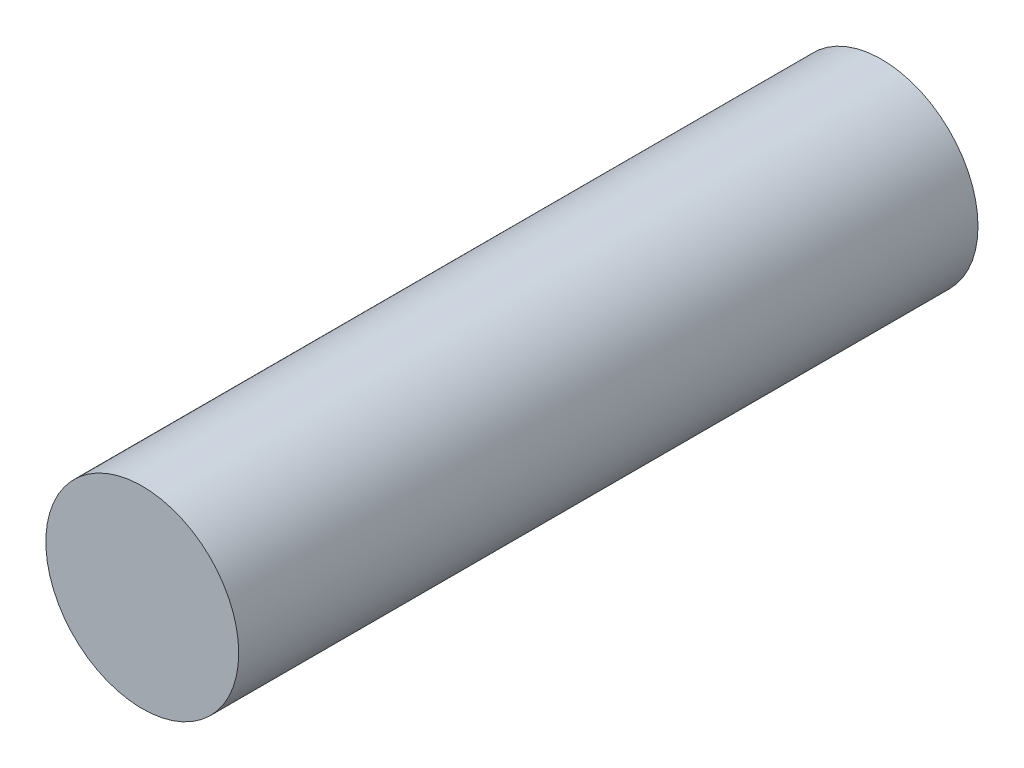
ISO-10303-21;
HEADER;
FILE_DESCRIPTION(('STEP AP214'),'2;1');
FILE_NAME('part.step','',(''),(''),'','','');
FILE_SCHEMA(('AUTOMOTIVE_DESIGN { 1 0 10303 214 1 1 1 1 }'));
ENDSEC;
DATA;
#1=APPLICATION_CONTEXT('core data for automotive mechanical design processes');
#2=APPLICATION_PROTOCOL_DEFINITION('international standard','automotive_design',2000,#1);
#3=PRODUCT_CONTEXT('',#1,'mechanical');
#4=PRODUCT('Part','Part','',(#3));
#5=PRODUCT_RELATED_PRODUCT_CATEGORY('part','',(#4));
#6=PRODUCT_DEFINITION_FORMATION('','',#4);
#7=PRODUCT_DEFINITION_CONTEXT('part definition',#1,'design');
#8=PRODUCT_DEFINITION('design','',#6,#7);
#9=PRODUCT_DEFINITION_SHAPE('','',#8);
#10=(LENGTH_UNIT() NAMED_UNIT(*) SI_UNIT(.MILLI.,.METRE.));
#11=(NAMED_UNIT(*) PLANE_ANGLE_UNIT() SI_UNIT($,.RADIAN.));
#12=(NAMED_UNIT(*) SI_UNIT($,.STERADIAN.) SOLID_ANGLE_UNIT());
#13=UNCERTAINTY_MEASURE_WITH_UNIT(LENGTH_MEASURE(1.E-05),#10,'distance_accuracy_value','');
#14=(GEOMETRIC_REPRESENTATION_CONTEXT(3) GLOBAL_UNCERTAINTY_ASSIGNED_CONTEXT((#13)) GLOBAL_UNIT_ASSIGNED_CONTEXT((#10,
#11,#12)) REPRESENTATION_CONTEXT('',''));
#15=CARTESIAN_POINT('',(0.,0.,0.));
#16=DIRECTION('',(0.,0.,1.));
#17=DIRECTION('',(1.,0.,0.));
#18=AXIS2_PLACEMENT_3D('',#15,#16,#17);
#19=CARTESIAN_POINT('',(0.,0.,23.));
#20=DIRECTION('',(0.,0.,-1.));
#21=DIRECTION('',(-1.,0.,0.));
#22=AXIS2_PLACEMENT_3D('',#19,#20,#21);
#23=CYLINDRICAL_SURFACE('',#22,3.);
#24=CARTESIAN_POINT('',(0.,0.,23.));
#25=DIRECTION('',(0.,0.,1.));
#26=DIRECTION('',(1.,0.,0.));
#27=AXIS2_PLACEMENT_3D('',#24,#25,#26);
#28=CIRCLE('',#27,3.);
#29=CARTESIAN_POINT('',(3.,0.,23.));
#30=VERTEX_POINT('',#29);
#31=EDGE_CURVE('E10',#30,#30,#28,.T.);
#32=ORIENTED_EDGE('',*,*,#31,.F.);
#33=EDGE_LOOP('',(#32));
#34=FACE_BOUND('',#33,.T.);
#35=CARTESIAN_POINT('',(0.,0.,0.));
#36=DIRECTION('',(0.,0.,1.));
#37=DIRECTION('',(1.,0.,0.));
#38=AXIS2_PLACEMENT_3D('',#35,#36,#37);
#39=CIRCLE('',#38,3.);
#40=CARTESIAN_POINT('',(3.,0.,0.));
#41=VERTEX_POINT('',#40);
#42=EDGE_CURVE('E38',#41,#41,#39,.T.);
#43=ORIENTED_EDGE('',*,*,#42,.T.);
#44=EDGE_LOOP('',(#43));
#45=FACE_BOUND('',#44,.T.);
#46=ADVANCED_FACE('F35',(#34,#45),#23,.T.);
#47=CARTESIAN_POINT('',(0.,0.,23.));
#48=DIRECTION('',(0.,0.,1.));
#49=DIRECTION('',(1.,0.,0.));
#50=AXIS2_PLACEMENT_3D('',#47,#48,#49);
#51=PLANE('',#50);
#52=ORIENTED_EDGE('',*,*,#31,.T.);
#53=EDGE_LOOP('',(#52));
#54=FACE_BOUND('',#53,.T.);
#55=ADVANCED_FACE('F50',(#54),#51,.T.);
#56=CARTESIAN_POINT('',(0.,0.,0.));
#57=DIRECTION('',(0.,0.,1.));
#58=DIRECTION('',(1.,0.,0.));
#59=AXIS2_PLACEMENT_3D('',#56,#57,#58);
#60=PLANE('',#59);
#61=ORIENTED_EDGE('',*,*,#42,.F.);
#62=EDGE_LOOP('',(#61));
#63=FACE_BOUND('',#62,.T.);
#64=ADVANCED_FACE('F48',(#63),#60,.F.);
#65=CLOSED_SHELL('',(#46,#55,#64));
#66=MANIFOLD_SOLID_BREP('B2',#65);
#67=ADVANCED_BREP_SHAPE_REPRESENTATION('',(#18,#66),#14);
#68=SHAPE_DEFINITION_REPRESENTATION(#9,#67);
ENDSEC;
END-ISO-10303-21;
